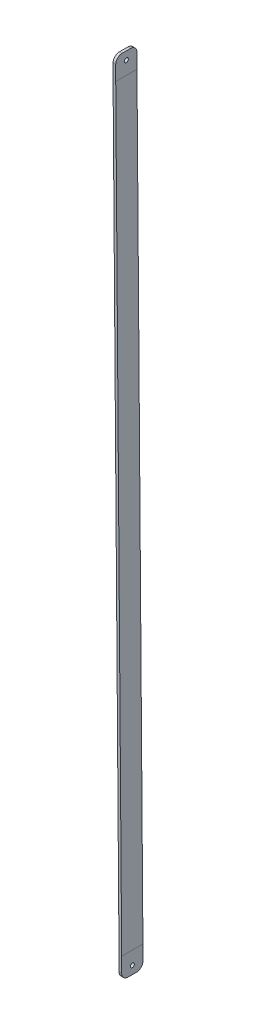
ISO-10303-21;
HEADER;
FILE_DESCRIPTION(('STEP AP214'),'2;1');
FILE_NAME('part.step','',(''),(''),'','','');
FILE_SCHEMA(('AUTOMOTIVE_DESIGN { 1 0 10303 214 1 1 1 1 }'));
ENDSEC;
DATA;
#1=APPLICATION_CONTEXT('core data for automotive mechanical design processes');
#2=APPLICATION_PROTOCOL_DEFINITION('international standard','automotive_design',2000,#1);
#3=PRODUCT_CONTEXT('',#1,'mechanical');
#4=PRODUCT('Part','Part','',(#3));
#5=PRODUCT_RELATED_PRODUCT_CATEGORY('part','',(#4));
#6=PRODUCT_DEFINITION_FORMATION('','',#4);
#7=PRODUCT_DEFINITION_CONTEXT('part definition',#1,'design');
#8=PRODUCT_DEFINITION('design','',#6,#7);
#9=PRODUCT_DEFINITION_SHAPE('','',#8);
#10=(LENGTH_UNIT() NAMED_UNIT(*) SI_UNIT(.MILLI.,.METRE.));
#11=(NAMED_UNIT(*) PLANE_ANGLE_UNIT() SI_UNIT($,.RADIAN.));
#12=(NAMED_UNIT(*) SI_UNIT($,.STERADIAN.) SOLID_ANGLE_UNIT());
#13=UNCERTAINTY_MEASURE_WITH_UNIT(LENGTH_MEASURE(1.E-05),#10,'distance_accuracy_value','');
#14=(GEOMETRIC_REPRESENTATION_CONTEXT(3) GLOBAL_UNCERTAINTY_ASSIGNED_CONTEXT((#13)) GLOBAL_UNIT_ASSIGNED_CONTEXT((#10,
#11,#12)) REPRESENTATION_CONTEXT('',''));
#15=CARTESIAN_POINT('',(0.,0.,0.));
#16=DIRECTION('',(0.,0.,1.));
#17=DIRECTION('',(1.,0.,0.));
#18=AXIS2_PLACEMENT_3D('',#15,#16,#17);
#19=CARTESIAN_POINT('',(0.,0.,12.7));
#20=DIRECTION('',(1.,0.,0.));
#21=DIRECTION('',(0.,0.,-1.));
#22=AXIS2_PLACEMENT_3D('',#19,#20,#21);
#23=PLANE('',#22);
#24=CARTESIAN_POINT('',(0.,9.65199999999988,0.));
#25=DIRECTION('',(1.,0.,0.));
#26=DIRECTION('',(0.,0.,-1.));
#27=AXIS2_PLACEMENT_3D('',#24,#25,#26);
#28=CIRCLE('',#27,2.413);
#29=CARTESIAN_POINT('',(0.,9.65199999999988,-2.413));
#30=VERTEX_POINT('',#29);
#31=EDGE_CURVE('E161',#30,#30,#28,.T.);
#32=ORIENTED_EDGE('',*,*,#31,.T.);
#33=EDGE_LOOP('',(#32));
#34=FACE_BOUND('',#33,.T.);
#35=DIRECTION('',(0.,0.,-1.));
#36=VECTOR('',#35,1.);
#37=CARTESIAN_POINT('',(0.,0.,12.7));
#38=LINE('',#37,#36);
#39=CARTESIAN_POINT('',(0.,0.,5.08));
#40=VERTEX_POINT('',#39);
#41=CARTESIAN_POINT('',(0.,0.,-5.08));
#42=VERTEX_POINT('',#41);
#43=EDGE_CURVE('E184',#40,#42,#38,.T.);
#44=ORIENTED_EDGE('',*,*,#43,.F.);
#45=CARTESIAN_POINT('',(0.,7.62,5.08));
#46=DIRECTION('',(1.,0.,0.));
#47=DIRECTION('',(0.,0.,-1.));
#48=AXIS2_PLACEMENT_3D('',#45,#46,#47);
#49=CIRCLE('',#48,7.62);
#50=CARTESIAN_POINT('',(0.,7.62,12.7));
#51=VERTEX_POINT('',#50);
#52=EDGE_CURVE('E202',#40,#51,#49,.F.);
#53=ORIENTED_EDGE('',*,*,#52,.T.);
#54=DIRECTION('',(0.,-1.,0.));
#55=VECTOR('',#54,1.);
#56=CARTESIAN_POINT('',(0.,0.,12.7));
#57=LINE('',#56,#55);
#58=CARTESIAN_POINT('',(0.,25.4,12.7));
#59=VERTEX_POINT('',#58);
#60=EDGE_CURVE('E133',#59,#51,#57,.T.);
#61=ORIENTED_EDGE('',*,*,#60,.F.);
#62=DIRECTION('',(0.,0.,-1.));
#63=VECTOR('',#62,1.);
#64=CARTESIAN_POINT('',(0.,25.4,12.7));
#65=LINE('',#64,#63);
#66=CARTESIAN_POINT('',(0.,25.4,-12.7));
#67=VERTEX_POINT('',#66);
#68=EDGE_CURVE('E157',#59,#67,#65,.T.);
#69=ORIENTED_EDGE('',*,*,#68,.T.);
#70=DIRECTION('',(0.,-1.,0.));
#71=VECTOR('',#70,1.);
#72=CARTESIAN_POINT('',(0.,0.,-12.7));
#73=LINE('',#72,#71);
#74=CARTESIAN_POINT('',(0.,7.62,-12.7));
#75=VERTEX_POINT('',#74);
#76=EDGE_CURVE('E158',#67,#75,#73,.T.);
#77=ORIENTED_EDGE('',*,*,#76,.T.);
#78=CARTESIAN_POINT('',(0.,7.62,-5.08));
#79=DIRECTION('',(1.,0.,0.));
#80=DIRECTION('',(0.,0.,-1.));
#81=AXIS2_PLACEMENT_3D('',#78,#79,#80);
#82=CIRCLE('',#81,7.62);
#83=EDGE_CURVE('E200',#75,#42,#82,.F.);
#84=ORIENTED_EDGE('',*,*,#83,.T.);
#85=EDGE_LOOP('',(#44,#53,#61,#69,#77,#84));
#86=FACE_BOUND('',#85,.T.);
#87=ADVANCED_FACE('F33',(#34,#86),#23,.F.);
#88=CARTESIAN_POINT('',(0.,0.,12.7));
#89=DIRECTION('',(0.,1.,0.));
#90=DIRECTION('',(0.,0.,1.));
#91=AXIS2_PLACEMENT_3D('',#88,#89,#90);
#92=PLANE('',#91);
#93=DIRECTION('',(0.,0.,-1.));
#94=VECTOR('',#93,1.);
#95=CARTESIAN_POINT('',(3.175,0.,12.7));
#96=LINE('',#95,#94);
#97=CARTESIAN_POINT('',(3.175,0.,5.08));
#98=VERTEX_POINT('',#97);
#99=CARTESIAN_POINT('',(3.175,0.,-5.08));
#100=VERTEX_POINT('',#99);
#101=EDGE_CURVE('E142',#98,#100,#96,.T.);
#102=ORIENTED_EDGE('',*,*,#101,.F.);
#103=DIRECTION('',(1.,0.,0.));
#104=VECTOR('',#103,1.);
#105=CARTESIAN_POINT('',(0.,0.,5.08));
#106=LINE('',#105,#104);
#107=EDGE_CURVE('E198',#98,#40,#106,.F.);
#108=ORIENTED_EDGE('',*,*,#107,.T.);
#109=ORIENTED_EDGE('',*,*,#43,.T.);
#110=DIRECTION('',(1.,0.,0.));
#111=VECTOR('',#110,1.);
#112=CARTESIAN_POINT('',(3.175,0.,-5.08));
#113=LINE('',#112,#111);
#114=EDGE_CURVE('E195',#42,#100,#113,.T.);
#115=ORIENTED_EDGE('',*,*,#114,.T.);
#116=EDGE_LOOP('',(#102,#108,#109,#115));
#117=FACE_BOUND('',#116,.T.);
#118=ADVANCED_FACE('F273',(#117),#92,.F.);
#119=CARTESIAN_POINT('',(3.175,0.,12.7));
#120=DIRECTION('',(-1.,0.,0.));
#121=DIRECTION('',(0.,0.,1.));
#122=AXIS2_PLACEMENT_3D('',#119,#120,#121);
#123=PLANE('',#122);
#124=CARTESIAN_POINT('',(3.175,9.65199999999988,0.));
#125=DIRECTION('',(1.,0.,0.));
#126=DIRECTION('',(0.,0.,-1.));
#127=AXIS2_PLACEMENT_3D('',#124,#125,#126);
#128=CIRCLE('',#127,2.413);
#129=CARTESIAN_POINT('',(3.175,9.65199999999988,-2.413));
#130=VERTEX_POINT('',#129);
#131=EDGE_CURVE('E250',#130,#130,#128,.T.);
#132=ORIENTED_EDGE('',*,*,#131,.F.);
#133=EDGE_LOOP('',(#132));
#134=FACE_BOUND('',#133,.T.);
#135=DIRECTION('',(0.,1.,0.));
#136=VECTOR('',#135,1.);
#137=CARTESIAN_POINT('',(3.175,0.,12.7));
#138=LINE('',#137,#136);
#139=CARTESIAN_POINT('',(3.175,7.62,12.7));
#140=VERTEX_POINT('',#139);
#141=CARTESIAN_POINT('',(3.175,25.4,12.7));
#142=VERTEX_POINT('',#141);
#143=EDGE_CURVE('E122',#140,#142,#138,.T.);
#144=ORIENTED_EDGE('',*,*,#143,.F.);
#145=CARTESIAN_POINT('',(3.175,7.62,5.08));
#146=DIRECTION('',(-1.,0.,0.));
#147=DIRECTION('',(0.,0.,1.));
#148=AXIS2_PLACEMENT_3D('',#145,#146,#147);
#149=CIRCLE('',#148,7.62);
#150=EDGE_CURVE('E193',#140,#98,#149,.F.);
#151=ORIENTED_EDGE('',*,*,#150,.T.);
#152=ORIENTED_EDGE('',*,*,#101,.T.);
#153=CARTESIAN_POINT('',(3.175,7.62,-5.08));
#154=DIRECTION('',(-1.,0.,0.));
#155=DIRECTION('',(0.,0.,1.));
#156=AXIS2_PLACEMENT_3D('',#153,#154,#155);
#157=CIRCLE('',#156,7.62);
#158=CARTESIAN_POINT('',(3.175,7.62,-12.7));
#159=VERTEX_POINT('',#158);
#160=EDGE_CURVE('E191',#100,#159,#157,.F.);
#161=ORIENTED_EDGE('',*,*,#160,.T.);
#162=DIRECTION('',(0.,1.,0.));
#163=VECTOR('',#162,1.);
#164=CARTESIAN_POINT('',(3.175,0.,-12.7));
#165=LINE('',#164,#163);
#166=CARTESIAN_POINT('',(3.175,25.4,-12.7));
#167=VERTEX_POINT('',#166);
#168=EDGE_CURVE('E139',#159,#167,#165,.T.);
#169=ORIENTED_EDGE('',*,*,#168,.T.);
#170=DIRECTION('',(0.,0.,-1.));
#171=VECTOR('',#170,1.);
#172=CARTESIAN_POINT('',(3.175,25.4,12.7));
#173=LINE('',#172,#171);
#174=EDGE_CURVE('E136',#142,#167,#173,.T.);
#175=ORIENTED_EDGE('',*,*,#174,.F.);
#176=EDGE_LOOP('',(#144,#151,#152,#161,#169,#175));
#177=FACE_BOUND('',#176,.T.);
#178=ADVANCED_FACE('F137',(#134,#177),#123,.F.);
#179=CARTESIAN_POINT('',(3.175,25.4,12.7));
#180=DIRECTION('',(-0.999968896511705,-0.00788707862037403,0.));
#181=DIRECTION('',(0.00788707862037403,-0.999968896511705,0.));
#182=AXIS2_PLACEMENT_3D('',#179,#180,#181);
#183=PLANE('',#182);
#184=DIRECTION('',(-0.00788707862037403,0.999968896511705,0.));
#185=VECTOR('',#184,1.);
#186=CARTESIAN_POINT('',(3.175,25.4,-12.7));
#187=LINE('',#186,#185);
#188=CARTESIAN_POINT('',(-3.93700000000002,927.1,-12.7));
#189=VERTEX_POINT('',#188);
#190=EDGE_CURVE('E163',#167,#189,#187,.T.);
#191=ORIENTED_EDGE('',*,*,#190,.T.);
#192=DIRECTION('',(0.,0.,-1.));
#193=VECTOR('',#192,1.);
#194=CARTESIAN_POINT('',(-3.93700000000002,927.1,12.7));
#195=LINE('',#194,#193);
#196=CARTESIAN_POINT('',(-3.93700000000002,927.1,12.7));
#197=VERTEX_POINT('',#196);
#198=EDGE_CURVE('E143',#197,#189,#195,.T.);
#199=ORIENTED_EDGE('',*,*,#198,.F.);
#200=DIRECTION('',(-0.00788707862037403,0.999968896511705,0.));
#201=VECTOR('',#200,1.);
#202=CARTESIAN_POINT('',(3.175,25.4,12.7));
#203=LINE('',#202,#201);
#204=EDGE_CURVE('E128',#142,#197,#203,.T.);
#205=ORIENTED_EDGE('',*,*,#204,.F.);
#206=ORIENTED_EDGE('',*,*,#174,.T.);
#207=EDGE_LOOP('',(#191,#199,#205,#206));
#208=FACE_BOUND('',#207,.T.);
#209=ADVANCED_FACE('F145',(#208),#183,.F.);
#210=CARTESIAN_POINT('',(-3.93700000000002,927.1,12.7));
#211=DIRECTION('',(-1.,0.,0.));
#212=DIRECTION('',(0.,0.,1.));
#213=AXIS2_PLACEMENT_3D('',#210,#211,#212);
#214=PLANE('',#213);
#215=CARTESIAN_POINT('',(-3.93700000000002,942.848,0.));
#216=DIRECTION('',(-1.,0.,0.));
#217=DIRECTION('',(0.,0.,1.));
#218=AXIS2_PLACEMENT_3D('',#215,#216,#217);
#219=CIRCLE('',#218,2.41300000000001);
#220=CARTESIAN_POINT('',(-3.93700000000002,942.848,2.41300000000001));
#221=VERTEX_POINT('',#220);
#222=EDGE_CURVE('E246',#221,#221,#219,.T.);
#223=ORIENTED_EDGE('',*,*,#222,.T.);
#224=EDGE_LOOP('',(#223));
#225=FACE_BOUND('',#224,.T.);
#226=DIRECTION('',(0.,1.,0.));
#227=VECTOR('',#226,1.);
#228=CARTESIAN_POINT('',(-3.93700000000002,927.1,-12.7));
#229=LINE('',#228,#227);
#230=CARTESIAN_POINT('',(-3.93700000000002,944.88,-12.7));
#231=VERTEX_POINT('',#230);
#232=EDGE_CURVE('E165',#189,#231,#229,.T.);
#233=ORIENTED_EDGE('',*,*,#232,.T.);
#234=CARTESIAN_POINT('',(-3.93700000000002,944.88,-5.08));
#235=DIRECTION('',(-1.,0.,0.));
#236=DIRECTION('',(0.,0.,1.));
#237=AXIS2_PLACEMENT_3D('',#234,#235,#236);
#238=CIRCLE('',#237,7.62);
#239=CARTESIAN_POINT('',(-3.93700000000002,952.5,-5.08));
#240=VERTEX_POINT('',#239);
#241=EDGE_CURVE('E11',#231,#240,#238,.F.);
#242=ORIENTED_EDGE('',*,*,#241,.T.);
#243=DIRECTION('',(0.,0.,-1.));
#244=VECTOR('',#243,1.);
#245=CARTESIAN_POINT('',(-3.93700000000002,952.5,12.7));
#246=LINE('',#245,#244);
#247=CARTESIAN_POINT('',(-3.93700000000002,952.5,5.08));
#248=VERTEX_POINT('',#247);
#249=EDGE_CURVE('E179',#248,#240,#246,.T.);
#250=ORIENTED_EDGE('',*,*,#249,.F.);
#251=CARTESIAN_POINT('',(-3.93700000000002,944.88,5.08));
#252=DIRECTION('',(-1.,0.,0.));
#253=DIRECTION('',(0.,0.,1.));
#254=AXIS2_PLACEMENT_3D('',#251,#252,#253);
#255=CIRCLE('',#254,7.62);
#256=CARTESIAN_POINT('',(-3.93700000000002,944.88,12.7));
#257=VERTEX_POINT('',#256);
#258=EDGE_CURVE('E41',#248,#257,#255,.F.);
#259=ORIENTED_EDGE('',*,*,#258,.T.);
#260=DIRECTION('',(0.,1.,0.));
#261=VECTOR('',#260,1.);
#262=CARTESIAN_POINT('',(-3.93700000000002,927.1,12.7));
#263=LINE('',#262,#261);
#264=EDGE_CURVE('E148',#197,#257,#263,.T.);
#265=ORIENTED_EDGE('',*,*,#264,.F.);
#266=ORIENTED_EDGE('',*,*,#198,.T.);
#267=EDGE_LOOP('',(#233,#242,#250,#259,#265,#266));
#268=FACE_BOUND('',#267,.T.);
#269=ADVANCED_FACE('F216',(#225,#268),#214,.F.);
#270=CARTESIAN_POINT('',(-7.11200000000001,952.5,12.7));
#271=DIRECTION('',(0.,-1.,0.));
#272=DIRECTION('',(0.,0.,-1.));
#273=AXIS2_PLACEMENT_3D('',#270,#271,#272);
#274=PLANE('',#273);
#275=ORIENTED_EDGE('',*,*,#249,.T.);
#276=DIRECTION('',(-1.,0.,0.));
#277=VECTOR('',#276,1.);
#278=CARTESIAN_POINT('',(-7.11200000000001,952.5,-5.08));
#279=LINE('',#278,#277);
#280=CARTESIAN_POINT('',(-7.11200000000001,952.5,-5.08));
#281=VERTEX_POINT('',#280);
#282=EDGE_CURVE('E209',#240,#281,#279,.T.);
#283=ORIENTED_EDGE('',*,*,#282,.T.);
#284=DIRECTION('',(0.,0.,-1.));
#285=VECTOR('',#284,1.);
#286=CARTESIAN_POINT('',(-7.11200000000001,952.5,12.7));
#287=LINE('',#286,#285);
#288=CARTESIAN_POINT('',(-7.11200000000001,952.5,5.08));
#289=VERTEX_POINT('',#288);
#290=EDGE_CURVE('E176',#289,#281,#287,.T.);
#291=ORIENTED_EDGE('',*,*,#290,.F.);
#292=DIRECTION('',(-1.,0.,0.));
#293=VECTOR('',#292,1.);
#294=CARTESIAN_POINT('',(-7.11200000000001,952.5,5.08));
#295=LINE('',#294,#293);
#296=EDGE_CURVE('E53',#289,#248,#295,.F.);
#297=ORIENTED_EDGE('',*,*,#296,.T.);
#298=EDGE_LOOP('',(#275,#283,#291,#297));
#299=FACE_BOUND('',#298,.T.);
#300=ADVANCED_FACE('F223',(#299),#274,.F.);
#301=CARTESIAN_POINT('',(-7.11200000000001,952.5,12.7));
#302=DIRECTION('',(1.,0.,0.));
#303=DIRECTION('',(0.,0.,-1.));
#304=AXIS2_PLACEMENT_3D('',#301,#302,#303);
#305=PLANE('',#304);
#306=CARTESIAN_POINT('',(-7.11200000000001,942.848,0.));
#307=DIRECTION('',(1.,0.,0.));
#308=DIRECTION('',(0.,0.,-1.));
#309=AXIS2_PLACEMENT_3D('',#306,#307,#308);
#310=CIRCLE('',#309,2.41300000000001);
#311=CARTESIAN_POINT('',(-7.11200000000001,942.848,-2.41300000000001));
#312=VERTEX_POINT('',#311);
#313=EDGE_CURVE('E249',#312,#312,#310,.T.);
#314=ORIENTED_EDGE('',*,*,#313,.T.);
#315=EDGE_LOOP('',(#314));
#316=FACE_BOUND('',#315,.T.);
#317=ORIENTED_EDGE('',*,*,#290,.T.);
#318=CARTESIAN_POINT('',(-7.11200000000001,944.88,-5.08));
#319=DIRECTION('',(1.,0.,0.));
#320=DIRECTION('',(0.,0.,-1.));
#321=AXIS2_PLACEMENT_3D('',#318,#319,#320);
#322=CIRCLE('',#321,7.62);
#323=CARTESIAN_POINT('',(-7.11200000000001,944.88,-12.7));
#324=VERTEX_POINT('',#323);
#325=EDGE_CURVE('E214',#281,#324,#322,.F.);
#326=ORIENTED_EDGE('',*,*,#325,.T.);
#327=DIRECTION('',(0.,-1.,0.));
#328=VECTOR('',#327,1.);
#329=CARTESIAN_POINT('',(-7.11200000000001,952.5,-12.7));
#330=LINE('',#329,#328);
#331=CARTESIAN_POINT('',(-7.11200000000001,927.1,-12.7));
#332=VERTEX_POINT('',#331);
#333=EDGE_CURVE('E167',#324,#332,#330,.T.);
#334=ORIENTED_EDGE('',*,*,#333,.T.);
#335=DIRECTION('',(0.,0.,-1.));
#336=VECTOR('',#335,1.);
#337=CARTESIAN_POINT('',(-7.11200000000001,927.1,12.7));
#338=LINE('',#337,#336);
#339=CARTESIAN_POINT('',(-7.11200000000001,927.1,12.7));
#340=VERTEX_POINT('',#339);
#341=EDGE_CURVE('E173',#340,#332,#338,.T.);
#342=ORIENTED_EDGE('',*,*,#341,.F.);
#343=DIRECTION('',(0.,-1.,0.));
#344=VECTOR('',#343,1.);
#345=CARTESIAN_POINT('',(-7.11200000000001,952.5,12.7));
#346=LINE('',#345,#344);
#347=CARTESIAN_POINT('',(-7.11200000000001,944.88,12.7));
#348=VERTEX_POINT('',#347);
#349=EDGE_CURVE('E150',#348,#340,#346,.T.);
#350=ORIENTED_EDGE('',*,*,#349,.F.);
#351=CARTESIAN_POINT('',(-7.11200000000001,944.88,5.08));
#352=DIRECTION('',(1.,0.,0.));
#353=DIRECTION('',(0.,0.,-1.));
#354=AXIS2_PLACEMENT_3D('',#351,#352,#353);
#355=CIRCLE('',#354,7.62);
#356=EDGE_CURVE('E212',#348,#289,#355,.F.);
#357=ORIENTED_EDGE('',*,*,#356,.T.);
#358=EDGE_LOOP('',(#317,#326,#334,#342,#350,#357));
#359=FACE_BOUND('',#358,.T.);
#360=ADVANCED_FACE('F221',(#316,#359),#305,.F.);
#361=CARTESIAN_POINT('',(0.,25.4,12.7));
#362=DIRECTION('',(0.999968896511705,0.00788707862037402,0.));
#363=DIRECTION('',(-0.00788707862037402,0.999968896511705,0.));
#364=AXIS2_PLACEMENT_3D('',#361,#362,#363);
#365=PLANE('',#364);
#366=DIRECTION('',(0.00788707862037402,-0.999968896511705,0.));
#367=VECTOR('',#366,1.);
#368=CARTESIAN_POINT('',(0.,25.4,-12.7));
#369=LINE('',#368,#367);
#370=EDGE_CURVE('E169',#332,#67,#369,.T.);
#371=ORIENTED_EDGE('',*,*,#370,.T.);
#372=ORIENTED_EDGE('',*,*,#68,.F.);
#373=DIRECTION('',(0.00788707862037402,-0.999968896511705,0.));
#374=VECTOR('',#373,1.);
#375=CARTESIAN_POINT('',(0.,25.4,12.7));
#376=LINE('',#375,#374);
#377=EDGE_CURVE('E155',#340,#59,#376,.T.);
#378=ORIENTED_EDGE('',*,*,#377,.F.);
#379=ORIENTED_EDGE('',*,*,#341,.T.);
#380=EDGE_LOOP('',(#371,#372,#378,#379));
#381=FACE_BOUND('',#380,.T.);
#382=ADVANCED_FACE('F236',(#381),#365,.F.);
#383=CARTESIAN_POINT('',(0.,0.,12.7));
#384=DIRECTION('',(0.,0.,-1.));
#385=DIRECTION('',(-1.,0.,0.));
#386=AXIS2_PLACEMENT_3D('',#383,#384,#385);
#387=PLANE('',#386);
#388=ORIENTED_EDGE('',*,*,#60,.T.);
#389=DIRECTION('',(1.,0.,0.));
#390=VECTOR('',#389,1.);
#391=CARTESIAN_POINT('',(0.,7.62,12.7));
#392=LINE('',#391,#390);
#393=EDGE_CURVE('E131',#51,#140,#392,.T.);
#394=ORIENTED_EDGE('',*,*,#393,.T.);
#395=ORIENTED_EDGE('',*,*,#143,.T.);
#396=ORIENTED_EDGE('',*,*,#204,.T.);
#397=ORIENTED_EDGE('',*,*,#264,.T.);
#398=DIRECTION('',(-1.,0.,0.));
#399=VECTOR('',#398,1.);
#400=CARTESIAN_POINT('',(0.,944.88,12.7));
#401=LINE('',#400,#399);
#402=EDGE_CURVE('E187',#257,#348,#401,.T.);
#403=ORIENTED_EDGE('',*,*,#402,.T.);
#404=ORIENTED_EDGE('',*,*,#349,.T.);
#405=ORIENTED_EDGE('',*,*,#377,.T.);
#406=EDGE_LOOP('',(#388,#394,#395,#396,#397,#403,#404,#405));
#407=FACE_BOUND('',#406,.T.);
#408=ADVANCED_FACE('F125',(#407),#387,.F.);
#409=CARTESIAN_POINT('',(0.,0.,-12.7));
#410=DIRECTION('',(0.,0.,-1.));
#411=DIRECTION('',(-1.,0.,0.));
#412=AXIS2_PLACEMENT_3D('',#409,#410,#411);
#413=PLANE('',#412);
#414=ORIENTED_EDGE('',*,*,#168,.F.);
#415=DIRECTION('',(1.,0.,0.));
#416=VECTOR('',#415,1.);
#417=CARTESIAN_POINT('',(0.,7.62,-12.7));
#418=LINE('',#417,#416);
#419=EDGE_CURVE('E206',#159,#75,#418,.F.);
#420=ORIENTED_EDGE('',*,*,#419,.T.);
#421=ORIENTED_EDGE('',*,*,#76,.F.);
#422=ORIENTED_EDGE('',*,*,#370,.F.);
#423=ORIENTED_EDGE('',*,*,#333,.F.);
#424=DIRECTION('',(-1.,0.,0.));
#425=VECTOR('',#424,1.);
#426=CARTESIAN_POINT('',(-3.93700000000002,944.88,-12.7));
#427=LINE('',#426,#425);
#428=EDGE_CURVE('E204',#324,#231,#427,.F.);
#429=ORIENTED_EDGE('',*,*,#428,.T.);
#430=ORIENTED_EDGE('',*,*,#232,.F.);
#431=ORIENTED_EDGE('',*,*,#190,.F.);
#432=EDGE_LOOP('',(#414,#420,#421,#422,#423,#429,#430,#431));
#433=FACE_BOUND('',#432,.T.);
#434=ADVANCED_FACE('F231',(#433),#413,.T.);
#435=CARTESIAN_POINT('',(0.,7.62,5.08));
#436=DIRECTION('',(1.,0.,0.));
#437=DIRECTION('',(0.,0.,-1.));
#438=AXIS2_PLACEMENT_3D('',#435,#436,#437);
#439=CYLINDRICAL_SURFACE('',#438,7.62);
#440=ORIENTED_EDGE('',*,*,#52,.F.);
#441=ORIENTED_EDGE('',*,*,#107,.F.);
#442=ORIENTED_EDGE('',*,*,#150,.F.);
#443=ORIENTED_EDGE('',*,*,#393,.F.);
#444=EDGE_LOOP('',(#440,#441,#442,#443));
#445=FACE_BOUND('',#444,.T.);
#446=ADVANCED_FACE('F283',(#445),#439,.T.);
#447=CARTESIAN_POINT('',(0.,7.62,-5.08));
#448=DIRECTION('',(-1.,0.,0.));
#449=DIRECTION('',(0.,0.,1.));
#450=AXIS2_PLACEMENT_3D('',#447,#448,#449);
#451=CYLINDRICAL_SURFACE('',#450,7.62);
#452=ORIENTED_EDGE('',*,*,#83,.F.);
#453=ORIENTED_EDGE('',*,*,#419,.F.);
#454=ORIENTED_EDGE('',*,*,#160,.F.);
#455=ORIENTED_EDGE('',*,*,#114,.F.);
#456=EDGE_LOOP('',(#452,#453,#454,#455));
#457=FACE_BOUND('',#456,.T.);
#458=ADVANCED_FACE('F286',(#457),#451,.T.);
#459=CARTESIAN_POINT('',(-7.11200000000001,944.88,-5.08));
#460=DIRECTION('',(1.,0.,0.));
#461=DIRECTION('',(0.,0.,-1.));
#462=AXIS2_PLACEMENT_3D('',#459,#460,#461);
#463=CYLINDRICAL_SURFACE('',#462,7.62);
#464=ORIENTED_EDGE('',*,*,#241,.F.);
#465=ORIENTED_EDGE('',*,*,#428,.F.);
#466=ORIENTED_EDGE('',*,*,#325,.F.);
#467=ORIENTED_EDGE('',*,*,#282,.F.);
#468=EDGE_LOOP('',(#464,#465,#466,#467));
#469=FACE_BOUND('',#468,.T.);
#470=ADVANCED_FACE('F226',(#469),#463,.T.);
#471=CARTESIAN_POINT('',(0.,944.88,5.08));
#472=DIRECTION('',(-1.,0.,0.));
#473=DIRECTION('',(0.,0.,1.));
#474=AXIS2_PLACEMENT_3D('',#471,#472,#473);
#475=CYLINDRICAL_SURFACE('',#474,7.62);
#476=ORIENTED_EDGE('',*,*,#258,.F.);
#477=ORIENTED_EDGE('',*,*,#296,.F.);
#478=ORIENTED_EDGE('',*,*,#356,.F.);
#479=ORIENTED_EDGE('',*,*,#402,.F.);
#480=EDGE_LOOP('',(#476,#477,#478,#479));
#481=FACE_BOUND('',#480,.T.);
#482=ADVANCED_FACE('F35',(#481),#475,.T.);
#483=CARTESIAN_POINT('',(-7.11200000000001,942.848,0.));
#484=DIRECTION('',(1.,0.,0.));
#485=DIRECTION('',(0.,0.,-1.));
#486=AXIS2_PLACEMENT_3D('',#483,#484,#485);
#487=CYLINDRICAL_SURFACE('',#486,2.41300000000001);
#488=ORIENTED_EDGE('',*,*,#313,.F.);
#489=EDGE_LOOP('',(#488));
#490=FACE_BOUND('',#489,.T.);
#491=ORIENTED_EDGE('',*,*,#222,.F.);
#492=EDGE_LOOP('',(#491));
#493=FACE_BOUND('',#492,.T.);
#494=ADVANCED_FACE('F257',(#490,#493),#487,.F.);
#495=CARTESIAN_POINT('',(-7.11200000000001,9.65199999999988,0.));
#496=DIRECTION('',(1.,0.,0.));
#497=DIRECTION('',(0.,0.,-1.));
#498=AXIS2_PLACEMENT_3D('',#495,#496,#497);
#499=CYLINDRICAL_SURFACE('',#498,2.413);
#500=ORIENTED_EDGE('',*,*,#131,.T.);
#501=EDGE_LOOP('',(#500));
#502=FACE_BOUND('',#501,.T.);
#503=ORIENTED_EDGE('',*,*,#31,.F.);
#504=EDGE_LOOP('',(#503));
#505=FACE_BOUND('',#504,.T.);
#506=ADVANCED_FACE('F260',(#502,#505),#499,.F.);
#507=CLOSED_SHELL('',(#87,#118,#178,#209,#269,#300,#360,#382,#408,#434,#446,#458,#470,#482,#494,#506));
#508=MANIFOLD_SOLID_BREP('B2',#507);
#509=ADVANCED_BREP_SHAPE_REPRESENTATION('',(#18,#508),#14);
#510=SHAPE_DEFINITION_REPRESENTATION(#9,#509);
ENDSEC;
END-ISO-10303-21;
